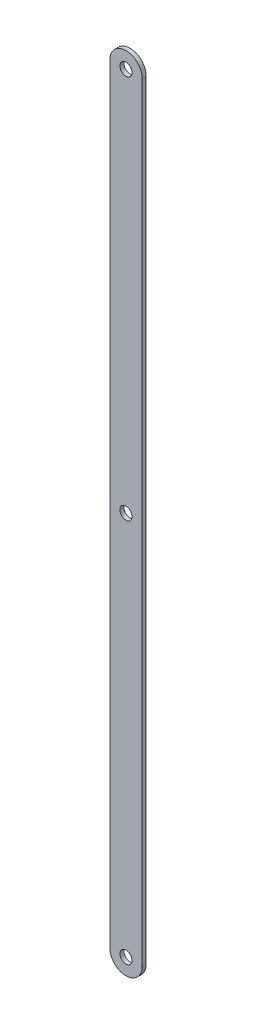
ISO-10303-21;
HEADER;
FILE_DESCRIPTION(('STEP AP214'),'2;1');
FILE_NAME('part.step','',(''),(''),'','','');
FILE_SCHEMA(('AUTOMOTIVE_DESIGN { 1 0 10303 214 1 1 1 1 }'));
ENDSEC;
DATA;
#1=APPLICATION_CONTEXT('core data for automotive mechanical design processes');
#2=APPLICATION_PROTOCOL_DEFINITION('international standard','automotive_design',2000,#1);
#3=PRODUCT_CONTEXT('',#1,'mechanical');
#4=PRODUCT('Part','Part','',(#3));
#5=PRODUCT_RELATED_PRODUCT_CATEGORY('part','',(#4));
#6=PRODUCT_DEFINITION_FORMATION('','',#4);
#7=PRODUCT_DEFINITION_CONTEXT('part definition',#1,'design');
#8=PRODUCT_DEFINITION('design','',#6,#7);
#9=PRODUCT_DEFINITION_SHAPE('','',#8);
#10=(LENGTH_UNIT() NAMED_UNIT(*) SI_UNIT(.MILLI.,.METRE.));
#11=(NAMED_UNIT(*) PLANE_ANGLE_UNIT() SI_UNIT($,.RADIAN.));
#12=(NAMED_UNIT(*) SI_UNIT($,.STERADIAN.) SOLID_ANGLE_UNIT());
#13=UNCERTAINTY_MEASURE_WITH_UNIT(LENGTH_MEASURE(1.E-05),#10,'distance_accuracy_value','');
#14=(GEOMETRIC_REPRESENTATION_CONTEXT(3) GLOBAL_UNCERTAINTY_ASSIGNED_CONTEXT((#13)) GLOBAL_UNIT_ASSIGNED_CONTEXT((#10,
#11,#12)) REPRESENTATION_CONTEXT('',''));
#15=CARTESIAN_POINT('',(0.,0.,0.));
#16=DIRECTION('',(0.,0.,1.));
#17=DIRECTION('',(1.,0.,0.));
#18=AXIS2_PLACEMENT_3D('',#15,#16,#17);
#19=CARTESIAN_POINT('',(-1.71450551880629E-13,475.,5.));
#20=DIRECTION('',(0.,0.,1.));
#21=DIRECTION('',(1.,0.,0.));
#22=AXIS2_PLACEMENT_3D('',#19,#20,#21);
#23=PLANE('',#22);
#24=CARTESIAN_POINT('',(0.,0.,5.));
#25=DIRECTION('',(0.,0.,1.));
#26=DIRECTION('',(1.,0.,0.));
#27=AXIS2_PLACEMENT_3D('',#24,#25,#26);
#28=CIRCLE('',#27,7.5);
#29=CARTESIAN_POINT('',(7.5,0.,5.));
#30=VERTEX_POINT('',#29);
#31=EDGE_CURVE('E115',#30,#30,#28,.T.);
#32=ORIENTED_EDGE('',*,*,#31,.F.);
#33=EDGE_LOOP('',(#32));
#34=FACE_BOUND('',#33,.T.);
#35=CARTESIAN_POINT('',(-1.71450551880629E-13,475.,5.));
#36=DIRECTION('',(0.,0.,1.));
#37=DIRECTION('',(1.,0.,0.));
#38=AXIS2_PLACEMENT_3D('',#35,#36,#37);
#39=CIRCLE('',#38,19.9999999999998);
#40=CARTESIAN_POINT('',(19.9999999999997,475.,5.));
#41=VERTEX_POINT('',#40);
#42=CARTESIAN_POINT('',(-20.,475.,5.));
#43=VERTEX_POINT('',#42);
#44=EDGE_CURVE('E85',#41,#43,#39,.T.);
#45=ORIENTED_EDGE('',*,*,#44,.T.);
#46=DIRECTION('',(0.,-1.,0.));
#47=VECTOR('',#46,1.);
#48=CARTESIAN_POINT('',(-20.,475.,5.));
#49=LINE('',#48,#47);
#50=CARTESIAN_POINT('',(-19.9999999999997,-475.,5.));
#51=VERTEX_POINT('',#50);
#52=EDGE_CURVE('E80',#43,#51,#49,.T.);
#53=ORIENTED_EDGE('',*,*,#52,.T.);
#54=CARTESIAN_POINT('',(1.19403062916867E-13,-475.,5.));
#55=DIRECTION('',(0.,0.,1.));
#56=DIRECTION('',(1.,0.,0.));
#57=AXIS2_PLACEMENT_3D('',#54,#55,#56);
#58=CIRCLE('',#57,19.9999999999998);
#59=CARTESIAN_POINT('',(20.,-475.,5.));
#60=VERTEX_POINT('',#59);
#61=EDGE_CURVE('E83',#51,#60,#58,.T.);
#62=ORIENTED_EDGE('',*,*,#61,.T.);
#63=DIRECTION('',(0.,1.,0.));
#64=VECTOR('',#63,1.);
#65=CARTESIAN_POINT('',(19.9999999999997,475.,5.));
#66=LINE('',#65,#64);
#67=EDGE_CURVE('E50',#60,#41,#66,.T.);
#68=ORIENTED_EDGE('',*,*,#67,.T.);
#69=EDGE_LOOP('',(#45,#53,#62,#68));
#70=FACE_BOUND('',#69,.T.);
#71=CARTESIAN_POINT('',(-1.71450551880629E-13,475.,5.));
#72=DIRECTION('',(0.,0.,1.));
#73=DIRECTION('',(1.,0.,0.));
#74=AXIS2_PLACEMENT_3D('',#71,#72,#73);
#75=CIRCLE('',#74,7.50000000000001);
#76=CARTESIAN_POINT('',(7.49999999999983,475.,5.));
#77=VERTEX_POINT('',#76);
#78=EDGE_CURVE('E100',#77,#77,#75,.T.);
#79=ORIENTED_EDGE('',*,*,#78,.F.);
#80=EDGE_LOOP('',(#79));
#81=FACE_BOUND('',#80,.T.);
#82=CARTESIAN_POINT('',(1.19403062916867E-13,-475.,5.));
#83=DIRECTION('',(0.,0.,1.));
#84=DIRECTION('',(1.,0.,0.));
#85=AXIS2_PLACEMENT_3D('',#82,#83,#84);
#86=CIRCLE('',#85,7.50000000000001);
#87=CARTESIAN_POINT('',(7.50000000000013,-475.,5.));
#88=VERTEX_POINT('',#87);
#89=EDGE_CURVE('E121',#88,#88,#86,.T.);
#90=ORIENTED_EDGE('',*,*,#89,.F.);
#91=EDGE_LOOP('',(#90));
#92=FACE_BOUND('',#91,.T.);
#93=ADVANCED_FACE('F33',(#34,#70,#81,#92),#23,.T.);
#94=CARTESIAN_POINT('',(-1.71450551880629E-13,475.,0.));
#95=DIRECTION('',(0.,0.,1.));
#96=DIRECTION('',(1.,0.,0.));
#97=AXIS2_PLACEMENT_3D('',#94,#95,#96);
#98=PLANE('',#97);
#99=CARTESIAN_POINT('',(-1.71450551880629E-13,475.,0.));
#100=DIRECTION('',(0.,0.,1.));
#101=DIRECTION('',(1.,0.,0.));
#102=AXIS2_PLACEMENT_3D('',#99,#100,#101);
#103=CIRCLE('',#102,19.9999999999998);
#104=CARTESIAN_POINT('',(19.9999999999997,475.,0.));
#105=VERTEX_POINT('',#104);
#106=CARTESIAN_POINT('',(-20.,475.,0.));
#107=VERTEX_POINT('',#106);
#108=EDGE_CURVE('E97',#105,#107,#103,.T.);
#109=ORIENTED_EDGE('',*,*,#108,.F.);
#110=DIRECTION('',(0.,1.,0.));
#111=VECTOR('',#110,1.);
#112=CARTESIAN_POINT('',(19.9999999999997,475.,0.));
#113=LINE('',#112,#111);
#114=CARTESIAN_POINT('',(20.,-475.,0.));
#115=VERTEX_POINT('',#114);
#116=EDGE_CURVE('E73',#115,#105,#113,.T.);
#117=ORIENTED_EDGE('',*,*,#116,.F.);
#118=CARTESIAN_POINT('',(1.19403062916867E-13,-475.,0.));
#119=DIRECTION('',(0.,0.,1.));
#120=DIRECTION('',(1.,0.,0.));
#121=AXIS2_PLACEMENT_3D('',#118,#119,#120);
#122=CIRCLE('',#121,19.9999999999998);
#123=CARTESIAN_POINT('',(-19.9999999999997,-475.,0.));
#124=VERTEX_POINT('',#123);
#125=EDGE_CURVE('E67',#124,#115,#122,.T.);
#126=ORIENTED_EDGE('',*,*,#125,.F.);
#127=DIRECTION('',(0.,-1.,0.));
#128=VECTOR('',#127,1.);
#129=CARTESIAN_POINT('',(-20.,475.,0.));
#130=LINE('',#129,#128);
#131=EDGE_CURVE('E89',#107,#124,#130,.T.);
#132=ORIENTED_EDGE('',*,*,#131,.F.);
#133=EDGE_LOOP('',(#109,#117,#126,#132));
#134=FACE_BOUND('',#133,.T.);
#135=CARTESIAN_POINT('',(-1.71450551880629E-13,475.,0.));
#136=DIRECTION('',(0.,0.,1.));
#137=DIRECTION('',(1.,0.,0.));
#138=AXIS2_PLACEMENT_3D('',#135,#136,#137);
#139=CIRCLE('',#138,7.50000000000001);
#140=CARTESIAN_POINT('',(7.49999999999983,475.,0.));
#141=VERTEX_POINT('',#140);
#142=EDGE_CURVE('E112',#141,#141,#139,.T.);
#143=ORIENTED_EDGE('',*,*,#142,.T.);
#144=EDGE_LOOP('',(#143));
#145=FACE_BOUND('',#144,.T.);
#146=CARTESIAN_POINT('',(0.,0.,0.));
#147=DIRECTION('',(0.,0.,1.));
#148=DIRECTION('',(1.,0.,0.));
#149=AXIS2_PLACEMENT_3D('',#146,#147,#148);
#150=CIRCLE('',#149,7.5);
#151=CARTESIAN_POINT('',(7.5,0.,0.));
#152=VERTEX_POINT('',#151);
#153=EDGE_CURVE('E118',#152,#152,#150,.T.);
#154=ORIENTED_EDGE('',*,*,#153,.T.);
#155=EDGE_LOOP('',(#154));
#156=FACE_BOUND('',#155,.T.);
#157=CARTESIAN_POINT('',(1.19403062916867E-13,-475.,0.));
#158=DIRECTION('',(0.,0.,1.));
#159=DIRECTION('',(1.,0.,0.));
#160=AXIS2_PLACEMENT_3D('',#157,#158,#159);
#161=CIRCLE('',#160,7.50000000000001);
#162=CARTESIAN_POINT('',(7.50000000000013,-475.,0.));
#163=VERTEX_POINT('',#162);
#164=EDGE_CURVE('E124',#163,#163,#161,.T.);
#165=ORIENTED_EDGE('',*,*,#164,.T.);
#166=EDGE_LOOP('',(#165));
#167=FACE_BOUND('',#166,.T.);
#168=ADVANCED_FACE('F108',(#134,#145,#156,#167),#98,.F.);
#169=CARTESIAN_POINT('',(-1.71450551880629E-13,475.,5.));
#170=DIRECTION('',(0.,0.,-1.));
#171=DIRECTION('',(-1.,0.,0.));
#172=AXIS2_PLACEMENT_3D('',#169,#170,#171);
#173=CYLINDRICAL_SURFACE('',#172,19.9999999999998);
#174=ORIENTED_EDGE('',*,*,#108,.T.);
#175=DIRECTION('',(0.,0.,-1.));
#176=VECTOR('',#175,1.);
#177=CARTESIAN_POINT('',(-20.,475.,5.));
#178=LINE('',#177,#176);
#179=EDGE_CURVE('E11',#43,#107,#178,.T.);
#180=ORIENTED_EDGE('',*,*,#179,.F.);
#181=ORIENTED_EDGE('',*,*,#44,.F.);
#182=DIRECTION('',(0.,0.,-1.));
#183=VECTOR('',#182,1.);
#184=CARTESIAN_POINT('',(19.9999999999997,475.,5.));
#185=LINE('',#184,#183);
#186=EDGE_CURVE('E93',#41,#105,#185,.T.);
#187=ORIENTED_EDGE('',*,*,#186,.T.);
#188=EDGE_LOOP('',(#174,#180,#181,#187));
#189=FACE_BOUND('',#188,.T.);
#190=ADVANCED_FACE('F35',(#189),#173,.T.);
#191=CARTESIAN_POINT('',(-20.,475.,5.));
#192=DIRECTION('',(1.,0.,0.));
#193=DIRECTION('',(0.,1.,0.));
#194=AXIS2_PLACEMENT_3D('',#191,#192,#193);
#195=PLANE('',#194);
#196=ORIENTED_EDGE('',*,*,#131,.T.);
#197=DIRECTION('',(0.,0.,-1.));
#198=VECTOR('',#197,1.);
#199=CARTESIAN_POINT('',(-19.9999999999997,-475.,5.));
#200=LINE('',#199,#198);
#201=EDGE_CURVE('E42',#51,#124,#200,.T.);
#202=ORIENTED_EDGE('',*,*,#201,.F.);
#203=ORIENTED_EDGE('',*,*,#52,.F.);
#204=ORIENTED_EDGE('',*,*,#179,.T.);
#205=EDGE_LOOP('',(#196,#202,#203,#204));
#206=FACE_BOUND('',#205,.T.);
#207=ADVANCED_FACE('F88',(#206),#195,.F.);
#208=CARTESIAN_POINT('',(1.19403062916867E-13,-475.,5.));
#209=DIRECTION('',(0.,0.,-1.));
#210=DIRECTION('',(-1.,0.,0.));
#211=AXIS2_PLACEMENT_3D('',#208,#209,#210);
#212=CYLINDRICAL_SURFACE('',#211,19.9999999999998);
#213=ORIENTED_EDGE('',*,*,#125,.T.);
#214=DIRECTION('',(0.,0.,-1.));
#215=VECTOR('',#214,1.);
#216=CARTESIAN_POINT('',(20.,-475.,5.));
#217=LINE('',#216,#215);
#218=EDGE_CURVE('E90',#60,#115,#217,.T.);
#219=ORIENTED_EDGE('',*,*,#218,.F.);
#220=ORIENTED_EDGE('',*,*,#61,.F.);
#221=ORIENTED_EDGE('',*,*,#201,.T.);
#222=EDGE_LOOP('',(#213,#219,#220,#221));
#223=FACE_BOUND('',#222,.T.);
#224=ADVANCED_FACE('F91',(#223),#212,.T.);
#225=CARTESIAN_POINT('',(19.9999999999997,475.,5.));
#226=DIRECTION('',(-1.,0.,0.));
#227=DIRECTION('',(0.,-1.,0.));
#228=AXIS2_PLACEMENT_3D('',#225,#226,#227);
#229=PLANE('',#228);
#230=ORIENTED_EDGE('',*,*,#116,.T.);
#231=ORIENTED_EDGE('',*,*,#186,.F.);
#232=ORIENTED_EDGE('',*,*,#67,.F.);
#233=ORIENTED_EDGE('',*,*,#218,.T.);
#234=EDGE_LOOP('',(#230,#231,#232,#233));
#235=FACE_BOUND('',#234,.T.);
#236=ADVANCED_FACE('F105',(#235),#229,.F.);
#237=CARTESIAN_POINT('',(-1.71450551880629E-13,475.,5.));
#238=DIRECTION('',(0.,0.,-1.));
#239=DIRECTION('',(-1.,0.,0.));
#240=AXIS2_PLACEMENT_3D('',#237,#238,#239);
#241=CYLINDRICAL_SURFACE('',#240,7.50000000000001);
#242=ORIENTED_EDGE('',*,*,#78,.T.);
#243=EDGE_LOOP('',(#242));
#244=FACE_BOUND('',#243,.T.);
#245=ORIENTED_EDGE('',*,*,#142,.F.);
#246=EDGE_LOOP('',(#245));
#247=FACE_BOUND('',#246,.T.);
#248=ADVANCED_FACE('F142',(#244,#247),#241,.F.);
#249=CARTESIAN_POINT('',(0.,0.,5.));
#250=DIRECTION('',(0.,0.,-1.));
#251=DIRECTION('',(-1.,0.,0.));
#252=AXIS2_PLACEMENT_3D('',#249,#250,#251);
#253=CYLINDRICAL_SURFACE('',#252,7.5);
#254=ORIENTED_EDGE('',*,*,#31,.T.);
#255=EDGE_LOOP('',(#254));
#256=FACE_BOUND('',#255,.T.);
#257=ORIENTED_EDGE('',*,*,#153,.F.);
#258=EDGE_LOOP('',(#257));
#259=FACE_BOUND('',#258,.T.);
#260=ADVANCED_FACE('F188',(#256,#259),#253,.F.);
#261=CARTESIAN_POINT('',(1.19403062916867E-13,-475.,5.));
#262=DIRECTION('',(0.,0.,-1.));
#263=DIRECTION('',(-1.,0.,0.));
#264=AXIS2_PLACEMENT_3D('',#261,#262,#263);
#265=CYLINDRICAL_SURFACE('',#264,7.50000000000001);
#266=ORIENTED_EDGE('',*,*,#89,.T.);
#267=EDGE_LOOP('',(#266));
#268=FACE_BOUND('',#267,.T.);
#269=ORIENTED_EDGE('',*,*,#164,.F.);
#270=EDGE_LOOP('',(#269));
#271=FACE_BOUND('',#270,.T.);
#272=ADVANCED_FACE('F130',(#268,#271),#265,.F.);
#273=CLOSED_SHELL('',(#93,#168,#190,#207,#224,#236,#248,#260,#272));
#274=MANIFOLD_SOLID_BREP('B2',#273);
#275=ADVANCED_BREP_SHAPE_REPRESENTATION('',(#18,#274),#14);
#276=SHAPE_DEFINITION_REPRESENTATION(#9,#275);
ENDSEC;
END-ISO-10303-21;
